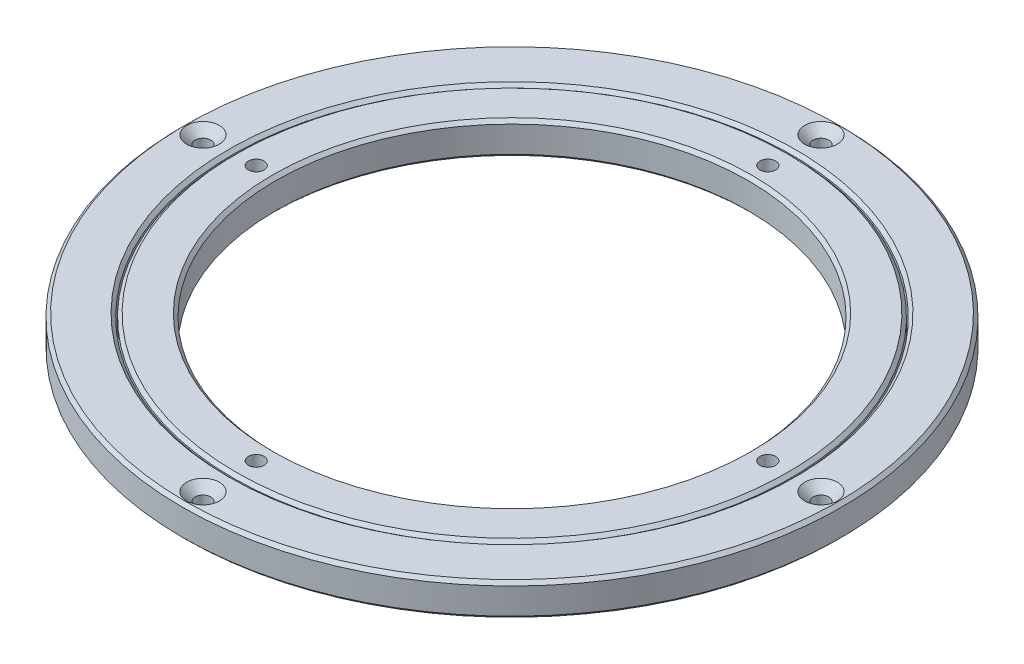
ISO-10303-21;
HEADER;
FILE_DESCRIPTION(('STEP AP214'),'2;1');
FILE_NAME('part.step','',(''),(''),'','','');
FILE_SCHEMA(('AUTOMOTIVE_DESIGN { 1 0 10303 214 1 1 1 1 }'));
ENDSEC;
DATA;
#1=APPLICATION_CONTEXT('core data for automotive mechanical design processes');
#2=APPLICATION_PROTOCOL_DEFINITION('international standard','automotive_design',2000,#1);
#3=PRODUCT_CONTEXT('',#1,'mechanical');
#4=PRODUCT('Part','Part','',(#3));
#5=PRODUCT_RELATED_PRODUCT_CATEGORY('part','',(#4));
#6=PRODUCT_DEFINITION_FORMATION('','',#4);
#7=PRODUCT_DEFINITION_CONTEXT('part definition',#1,'design');
#8=PRODUCT_DEFINITION('design','',#6,#7);
#9=PRODUCT_DEFINITION_SHAPE('','',#8);
#10=(LENGTH_UNIT() NAMED_UNIT(*) SI_UNIT(.MILLI.,.METRE.));
#11=(NAMED_UNIT(*) PLANE_ANGLE_UNIT() SI_UNIT($,.RADIAN.));
#12=(NAMED_UNIT(*) SI_UNIT($,.STERADIAN.) SOLID_ANGLE_UNIT());
#13=UNCERTAINTY_MEASURE_WITH_UNIT(LENGTH_MEASURE(1.E-05),#10,'distance_accuracy_value','');
#14=(GEOMETRIC_REPRESENTATION_CONTEXT(3) GLOBAL_UNCERTAINTY_ASSIGNED_CONTEXT((#13)) GLOBAL_UNIT_ASSIGNED_CONTEXT((#10,
#11,#12)) REPRESENTATION_CONTEXT('',''));
#15=CARTESIAN_POINT('',(0.,0.,0.));
#16=DIRECTION('',(0.,0.,1.));
#17=DIRECTION('',(1.,0.,0.));
#18=AXIS2_PLACEMENT_3D('',#15,#16,#17);
#19=CARTESIAN_POINT('',(0.,0.,0.));
#20=DIRECTION('',(0.,1.,0.));
#21=DIRECTION('',(0.,0.,1.));
#22=AXIS2_PLACEMENT_3D('',#19,#20,#21);
#23=PLANE('',#22);
#24=CARTESIAN_POINT('',(0.,0.,0.));
#25=DIRECTION('',(0.,1.,0.));
#26=DIRECTION('',(0.,0.,1.));
#27=AXIS2_PLACEMENT_3D('',#24,#25,#26);
#28=CIRCLE('',#27,85.475);
#29=CARTESIAN_POINT('',(0.,0.,85.475));
#30=VERTEX_POINT('',#29);
#31=EDGE_CURVE('E113',#30,#30,#28,.T.);
#32=ORIENTED_EDGE('',*,*,#31,.F.);
#33=EDGE_LOOP('',(#32));
#34=FACE_BOUND('',#33,.T.);
#35=CARTESIAN_POINT('',(0.,0.,0.));
#36=DIRECTION('',(0.,1.,0.));
#37=DIRECTION('',(0.,0.,1.));
#38=AXIS2_PLACEMENT_3D('',#35,#36,#37);
#39=CIRCLE('',#38,73.375);
#40=CARTESIAN_POINT('',(0.,0.,73.375));
#41=VERTEX_POINT('',#40);
#42=CARTESIAN_POINT('',(73.375,0.,0.));
#43=VERTEX_POINT('',#42);
#44=EDGE_CURVE('E97',#41,#43,#39,.T.);
#45=ORIENTED_EDGE('',*,*,#44,.T.);
#46=CARTESIAN_POINT('',(78.375,0.,0.));
#47=DIRECTION('',(0.,-1.,0.));
#48=DIRECTION('',(0.,0.,-1.));
#49=AXIS2_PLACEMENT_3D('',#46,#47,#48);
#50=CIRCLE('',#49,5.);
#51=EDGE_CURVE('E69',#43,#43,#50,.T.);
#52=ORIENTED_EDGE('',*,*,#51,.F.);
#53=CARTESIAN_POINT('',(0.,0.,-73.375));
#54=VERTEX_POINT('',#53);
#55=EDGE_CURVE('E75',#43,#54,#39,.T.);
#56=ORIENTED_EDGE('',*,*,#55,.T.);
#57=CARTESIAN_POINT('',(0.,0.,-78.375));
#58=DIRECTION('',(0.,-1.,0.));
#59=DIRECTION('',(0.,0.,-1.));
#60=AXIS2_PLACEMENT_3D('',#57,#58,#59);
#61=CIRCLE('',#60,5.);
#62=EDGE_CURVE('E231',#54,#54,#61,.T.);
#63=ORIENTED_EDGE('',*,*,#62,.F.);
#64=CARTESIAN_POINT('',(-73.375,0.,0.));
#65=VERTEX_POINT('',#64);
#66=EDGE_CURVE('E94',#54,#65,#39,.T.);
#67=ORIENTED_EDGE('',*,*,#66,.T.);
#68=CARTESIAN_POINT('',(-78.375,0.,0.));
#69=DIRECTION('',(0.,-1.,0.));
#70=DIRECTION('',(0.,0.,-1.));
#71=AXIS2_PLACEMENT_3D('',#68,#69,#70);
#72=CIRCLE('',#71,5.);
#73=EDGE_CURVE('E91',#65,#65,#72,.T.);
#74=ORIENTED_EDGE('',*,*,#73,.F.);
#75=EDGE_CURVE('E85',#65,#41,#39,.T.);
#76=ORIENTED_EDGE('',*,*,#75,.T.);
#77=CARTESIAN_POINT('',(0.,0.,78.375));
#78=DIRECTION('',(0.,-1.,0.));
#79=DIRECTION('',(0.,0.,-1.));
#80=AXIS2_PLACEMENT_3D('',#77,#78,#79);
#81=CIRCLE('',#80,5.);
#82=EDGE_CURVE('E88',#41,#41,#81,.T.);
#83=ORIENTED_EDGE('',*,*,#82,.F.);
#84=EDGE_LOOP('',(#45,#52,#56,#63,#67,#74,#76,#83));
#85=FACE_BOUND('',#84,.T.);
#86=ADVANCED_FACE('F55',(#34,#85),#23,.F.);
#87=CARTESIAN_POINT('',(0.,10.,0.));
#88=DIRECTION('',(0.,-1.,0.));
#89=DIRECTION('',(0.,0.,-1.));
#90=AXIS2_PLACEMENT_3D('',#87,#88,#89);
#91=CYLINDRICAL_SURFACE('',#90,72.375);
#92=CARTESIAN_POINT('',(0.,1.00000000000001,0.));
#93=DIRECTION('',(0.,1.,0.));
#94=DIRECTION('',(0.,0.,1.));
#95=AXIS2_PLACEMENT_3D('',#92,#93,#94);
#96=CIRCLE('',#95,72.375);
#97=CARTESIAN_POINT('',(0.,1.00000000000001,72.375));
#98=VERTEX_POINT('',#97);
#99=EDGE_CURVE('E13',#98,#98,#96,.F.);
#100=ORIENTED_EDGE('',*,*,#99,.T.);
#101=EDGE_LOOP('',(#100));
#102=FACE_BOUND('',#101,.T.);
#103=CARTESIAN_POINT('',(0.,9.00000000000003,0.));
#104=DIRECTION('',(0.,1.,0.));
#105=DIRECTION('',(0.,0.,1.));
#106=AXIS2_PLACEMENT_3D('',#103,#104,#105);
#107=CIRCLE('',#106,72.375);
#108=CARTESIAN_POINT('',(0.,9.00000000000003,72.375));
#109=VERTEX_POINT('',#108);
#110=EDGE_CURVE('E64',#109,#109,#107,.T.);
#111=ORIENTED_EDGE('',*,*,#110,.T.);
#112=EDGE_LOOP('',(#111));
#113=FACE_BOUND('',#112,.T.);
#114=ADVANCED_FACE('F126',(#102,#113),#91,.F.);
#115=CARTESIAN_POINT('',(0.,10.,0.));
#116=DIRECTION('',(0.,-1.,0.));
#117=DIRECTION('',(0.,0.,-1.));
#118=AXIS2_PLACEMENT_3D('',#115,#116,#117);
#119=CYLINDRICAL_SURFACE('',#118,85.475);
#120=CARTESIAN_POINT('',(0.,9.00000000000006,0.));
#121=DIRECTION('',(0.,1.,0.));
#122=DIRECTION('',(0.,0.,1.));
#123=AXIS2_PLACEMENT_3D('',#120,#121,#122);
#124=CIRCLE('',#123,85.475);
#125=CARTESIAN_POINT('',(0.,9.00000000000006,85.475));
#126=VERTEX_POINT('',#125);
#127=EDGE_CURVE('E95',#126,#126,#124,.F.);
#128=ORIENTED_EDGE('',*,*,#127,.T.);
#129=EDGE_LOOP('',(#128));
#130=FACE_BOUND('',#129,.T.);
#131=ORIENTED_EDGE('',*,*,#31,.T.);
#132=EDGE_LOOP('',(#131));
#133=FACE_BOUND('',#132,.T.);
#134=ADVANCED_FACE('F151',(#130,#133),#119,.T.);
#135=CARTESIAN_POINT('',(0.,10.,0.));
#136=DIRECTION('',(0.,1.,0.));
#137=DIRECTION('',(0.,0.,1.));
#138=AXIS2_PLACEMENT_3D('',#135,#136,#137);
#139=PLANE('',#138);
#140=CARTESIAN_POINT('',(78.375,9.99999999999999,0.));
#141=DIRECTION('',(0.,-1.,0.));
#142=DIRECTION('',(0.,0.,-1.));
#143=AXIS2_PLACEMENT_3D('',#140,#141,#142);
#144=CIRCLE('',#143,2.39999999999999);
#145=CARTESIAN_POINT('',(78.375,9.99999999999999,-2.39999999999999));
#146=VERTEX_POINT('',#145);
#147=EDGE_CURVE('E185',#146,#146,#144,.T.);
#148=ORIENTED_EDGE('',*,*,#147,.T.);
#149=EDGE_LOOP('',(#148));
#150=FACE_BOUND('',#149,.T.);
#151=CARTESIAN_POINT('',(0.,9.99999999999999,-78.375));
#152=DIRECTION('',(0.,-1.,0.));
#153=DIRECTION('',(0.,0.,-1.));
#154=AXIS2_PLACEMENT_3D('',#151,#152,#153);
#155=CIRCLE('',#154,2.39999999999999);
#156=CARTESIAN_POINT('',(0.,9.99999999999999,-80.775));
#157=VERTEX_POINT('',#156);
#158=EDGE_CURVE('E189',#157,#157,#155,.T.);
#159=ORIENTED_EDGE('',*,*,#158,.T.);
#160=EDGE_LOOP('',(#159));
#161=FACE_BOUND('',#160,.T.);
#162=CARTESIAN_POINT('',(-78.375,9.99999999999999,0.));
#163=DIRECTION('',(0.,-1.,0.));
#164=DIRECTION('',(0.,0.,-1.));
#165=AXIS2_PLACEMENT_3D('',#162,#163,#164);
#166=CIRCLE('',#165,2.39999999999999);
#167=CARTESIAN_POINT('',(-78.375,9.99999999999999,-2.39999999999999));
#168=VERTEX_POINT('',#167);
#169=EDGE_CURVE('E101',#168,#168,#166,.T.);
#170=ORIENTED_EDGE('',*,*,#169,.T.);
#171=EDGE_LOOP('',(#170));
#172=FACE_BOUND('',#171,.T.);
#173=CARTESIAN_POINT('',(0.,9.99999999999999,78.375));
#174=DIRECTION('',(0.,-1.,0.));
#175=DIRECTION('',(0.,0.,-1.));
#176=AXIS2_PLACEMENT_3D('',#173,#174,#175);
#177=CIRCLE('',#176,2.39999999999999);
#178=CARTESIAN_POINT('',(0.,9.99999999999999,75.975));
#179=VERTEX_POINT('',#178);
#180=EDGE_CURVE('E104',#179,#179,#177,.T.);
#181=ORIENTED_EDGE('',*,*,#180,.T.);
#182=EDGE_LOOP('',(#181));
#183=FACE_BOUND('',#182,.T.);
#184=CARTESIAN_POINT('',(0.,10.,0.));
#185=DIRECTION('',(0.,1.,0.));
#186=DIRECTION('',(0.,0.,1.));
#187=AXIS2_PLACEMENT_3D('',#184,#185,#186);
#188=CIRCLE('',#187,84.4750000000001);
#189=CARTESIAN_POINT('',(0.,10.,84.4750000000001));
#190=VERTEX_POINT('',#189);
#191=EDGE_CURVE('E119',#190,#190,#188,.T.);
#192=ORIENTED_EDGE('',*,*,#191,.T.);
#193=EDGE_LOOP('',(#192));
#194=FACE_BOUND('',#193,.T.);
#195=CARTESIAN_POINT('',(0.,10.,0.));
#196=DIRECTION('',(0.,1.,0.));
#197=DIRECTION('',(0.,0.,1.));
#198=AXIS2_PLACEMENT_3D('',#195,#196,#197);
#199=CIRCLE('',#198,73.375);
#200=CARTESIAN_POINT('',(0.,10.,73.375));
#201=VERTEX_POINT('',#200);
#202=EDGE_CURVE('E116',#201,#201,#199,.F.);
#203=ORIENTED_EDGE('',*,*,#202,.T.);
#204=EDGE_LOOP('',(#203));
#205=FACE_BOUND('',#204,.T.);
#206=ADVANCED_FACE('F157',(#150,#161,#172,#183,#194,#205),#139,.T.);
#207=CARTESIAN_POINT('',(0.,10.,0.));
#208=DIRECTION('',(0.,-1.,0.));
#209=DIRECTION('',(0.,0.,-1.));
#210=AXIS2_PLACEMENT_3D('',#207,#208,#209);
#211=CONICAL_SURFACE('',#210,84.4750000000001,0.785398163397441);
#212=ORIENTED_EDGE('',*,*,#127,.F.);
#213=EDGE_LOOP('',(#212));
#214=FACE_BOUND('',#213,.T.);
#215=ORIENTED_EDGE('',*,*,#191,.F.);
#216=EDGE_LOOP('',(#215));
#217=FACE_BOUND('',#216,.T.);
#218=ADVANCED_FACE('F140',(#214,#217),#211,.T.);
#219=CARTESIAN_POINT('',(0.,0.,0.));
#220=DIRECTION('',(0.,-1.,0.));
#221=DIRECTION('',(0.,0.,-1.));
#222=AXIS2_PLACEMENT_3D('',#219,#220,#221);
#223=CONICAL_SURFACE('',#222,73.375,0.785398163397441);
#224=ORIENTED_EDGE('',*,*,#99,.F.);
#225=EDGE_LOOP('',(#224));
#226=FACE_BOUND('',#225,.T.);
#227=ORIENTED_EDGE('',*,*,#44,.F.);
#228=ORIENTED_EDGE('',*,*,#75,.F.);
#229=ORIENTED_EDGE('',*,*,#66,.F.);
#230=ORIENTED_EDGE('',*,*,#55,.F.);
#231=EDGE_LOOP('',(#227,#228,#229,#230));
#232=FACE_BOUND('',#231,.T.);
#233=ADVANCED_FACE('F130',(#226,#232),#223,.F.);
#234=CARTESIAN_POINT('',(0.,9.00000000000003,0.));
#235=DIRECTION('',(0.,1.,0.));
#236=DIRECTION('',(0.,0.,1.));
#237=AXIS2_PLACEMENT_3D('',#234,#235,#236);
#238=CONICAL_SURFACE('',#237,72.375,0.785398163397448);
#239=ORIENTED_EDGE('',*,*,#202,.F.);
#240=EDGE_LOOP('',(#239));
#241=FACE_BOUND('',#240,.T.);
#242=ORIENTED_EDGE('',*,*,#110,.F.);
#243=EDGE_LOOP('',(#242));
#244=FACE_BOUND('',#243,.T.);
#245=ADVANCED_FACE('F58',(#241,#244),#238,.F.);
#246=CARTESIAN_POINT('',(0.,0.,78.375));
#247=DIRECTION('',(0.,-1.,0.));
#248=DIRECTION('',(0.,0.,-1.));
#249=AXIS2_PLACEMENT_3D('',#246,#247,#248);
#250=CYLINDRICAL_SURFACE('',#249,2.39999999999999);
#251=ORIENTED_EDGE('',*,*,#180,.F.);
#252=EDGE_LOOP('',(#251));
#253=FACE_BOUND('',#252,.T.);
#254=CARTESIAN_POINT('',(0.,2.6,78.375));
#255=DIRECTION('',(0.,-1.,0.));
#256=DIRECTION('',(0.,0.,-1.));
#257=AXIS2_PLACEMENT_3D('',#254,#255,#256);
#258=CIRCLE('',#257,2.39999999999999);
#259=CARTESIAN_POINT('',(0.,2.6,75.975));
#260=VERTEX_POINT('',#259);
#261=EDGE_CURVE('E100',#260,#260,#258,.T.);
#262=ORIENTED_EDGE('',*,*,#261,.T.);
#263=EDGE_LOOP('',(#262));
#264=FACE_BOUND('',#263,.T.);
#265=ADVANCED_FACE('F129',(#253,#264),#250,.F.);
#266=CARTESIAN_POINT('',(0.,0.,78.375));
#267=DIRECTION('',(0.,-1.,0.));
#268=DIRECTION('',(0.,0.,-1.));
#269=AXIS2_PLACEMENT_3D('',#266,#267,#268);
#270=CONICAL_SURFACE('',#269,5.,0.78539816339745);
#271=ORIENTED_EDGE('',*,*,#261,.F.);
#272=EDGE_LOOP('',(#271));
#273=FACE_BOUND('',#272,.T.);
#274=ORIENTED_EDGE('',*,*,#82,.T.);
#275=EDGE_LOOP('',(#274));
#276=FACE_BOUND('',#275,.T.);
#277=ADVANCED_FACE('F99',(#273,#276),#270,.F.);
#278=CARTESIAN_POINT('',(-78.375,0.,0.));
#279=DIRECTION('',(0.,-1.,0.));
#280=DIRECTION('',(0.,0.,-1.));
#281=AXIS2_PLACEMENT_3D('',#278,#279,#280);
#282=CYLINDRICAL_SURFACE('',#281,2.39999999999999);
#283=ORIENTED_EDGE('',*,*,#169,.F.);
#284=EDGE_LOOP('',(#283));
#285=FACE_BOUND('',#284,.T.);
#286=CARTESIAN_POINT('',(-78.375,2.6,0.));
#287=DIRECTION('',(0.,-1.,0.));
#288=DIRECTION('',(0.,0.,-1.));
#289=AXIS2_PLACEMENT_3D('',#286,#287,#288);
#290=CIRCLE('',#289,2.39999999999999);
#291=CARTESIAN_POINT('',(-78.375,2.6,-2.39999999999999));
#292=VERTEX_POINT('',#291);
#293=EDGE_CURVE('E107',#292,#292,#290,.T.);
#294=ORIENTED_EDGE('',*,*,#293,.T.);
#295=EDGE_LOOP('',(#294));
#296=FACE_BOUND('',#295,.T.);
#297=ADVANCED_FACE('F197',(#285,#296),#282,.F.);
#298=CARTESIAN_POINT('',(-78.375,0.,0.));
#299=DIRECTION('',(0.,-1.,0.));
#300=DIRECTION('',(0.,0.,-1.));
#301=AXIS2_PLACEMENT_3D('',#298,#299,#300);
#302=CONICAL_SURFACE('',#301,5.,0.785398163397451);
#303=ORIENTED_EDGE('',*,*,#293,.F.);
#304=EDGE_LOOP('',(#303));
#305=FACE_BOUND('',#304,.T.);
#306=ORIENTED_EDGE('',*,*,#73,.T.);
#307=EDGE_LOOP('',(#306));
#308=FACE_BOUND('',#307,.T.);
#309=ADVANCED_FACE('F202',(#305,#308),#302,.F.);
#310=CARTESIAN_POINT('',(0.,0.,-78.375));
#311=DIRECTION('',(0.,-1.,0.));
#312=DIRECTION('',(0.,0.,-1.));
#313=AXIS2_PLACEMENT_3D('',#310,#311,#312);
#314=CYLINDRICAL_SURFACE('',#313,2.39999999999999);
#315=ORIENTED_EDGE('',*,*,#158,.F.);
#316=EDGE_LOOP('',(#315));
#317=FACE_BOUND('',#316,.T.);
#318=CARTESIAN_POINT('',(0.,2.6,-78.375));
#319=DIRECTION('',(0.,-1.,0.));
#320=DIRECTION('',(0.,0.,-1.));
#321=AXIS2_PLACEMENT_3D('',#318,#319,#320);
#322=CIRCLE('',#321,2.39999999999999);
#323=CARTESIAN_POINT('',(0.,2.6,-80.775));
#324=VERTEX_POINT('',#323);
#325=EDGE_CURVE('E236',#324,#324,#322,.T.);
#326=ORIENTED_EDGE('',*,*,#325,.T.);
#327=EDGE_LOOP('',(#326));
#328=FACE_BOUND('',#327,.T.);
#329=ADVANCED_FACE('F208',(#317,#328),#314,.F.);
#330=CARTESIAN_POINT('',(0.,0.,-78.375));
#331=DIRECTION('',(0.,-1.,0.));
#332=DIRECTION('',(0.,0.,-1.));
#333=AXIS2_PLACEMENT_3D('',#330,#331,#332);
#334=CONICAL_SURFACE('',#333,5.,0.78539816339745);
#335=ORIENTED_EDGE('',*,*,#325,.F.);
#336=EDGE_LOOP('',(#335));
#337=FACE_BOUND('',#336,.T.);
#338=ORIENTED_EDGE('',*,*,#62,.T.);
#339=EDGE_LOOP('',(#338));
#340=FACE_BOUND('',#339,.T.);
#341=ADVANCED_FACE('F212',(#337,#340),#334,.F.);
#342=CARTESIAN_POINT('',(78.375,0.,0.));
#343=DIRECTION('',(0.,-1.,0.));
#344=DIRECTION('',(0.,0.,-1.));
#345=AXIS2_PLACEMENT_3D('',#342,#343,#344);
#346=CYLINDRICAL_SURFACE('',#345,2.39999999999999);
#347=ORIENTED_EDGE('',*,*,#147,.F.);
#348=EDGE_LOOP('',(#347));
#349=FACE_BOUND('',#348,.T.);
#350=CARTESIAN_POINT('',(78.375,2.6,0.));
#351=DIRECTION('',(0.,-1.,0.));
#352=DIRECTION('',(0.,0.,-1.));
#353=AXIS2_PLACEMENT_3D('',#350,#351,#352);
#354=CIRCLE('',#353,2.39999999999999);
#355=CARTESIAN_POINT('',(78.375,2.6,-2.39999999999999));
#356=VERTEX_POINT('',#355);
#357=EDGE_CURVE('E228',#356,#356,#354,.T.);
#358=ORIENTED_EDGE('',*,*,#357,.T.);
#359=EDGE_LOOP('',(#358));
#360=FACE_BOUND('',#359,.T.);
#361=ADVANCED_FACE('F216',(#349,#360),#346,.F.);
#362=CARTESIAN_POINT('',(78.375,0.,0.));
#363=DIRECTION('',(0.,-1.,0.));
#364=DIRECTION('',(0.,0.,-1.));
#365=AXIS2_PLACEMENT_3D('',#362,#363,#364);
#366=CONICAL_SURFACE('',#365,5.,0.785398163397451);
#367=ORIENTED_EDGE('',*,*,#357,.F.);
#368=EDGE_LOOP('',(#367));
#369=FACE_BOUND('',#368,.T.);
#370=ORIENTED_EDGE('',*,*,#51,.T.);
#371=EDGE_LOOP('',(#370));
#372=FACE_BOUND('',#371,.T.);
#373=ADVANCED_FACE('F220',(#369,#372),#366,.F.);
#374=CLOSED_SHELL('',(#86,#114,#134,#206,#218,#233,#245,#265,#277,#297,#309,#329,#341,#361,#373));
#375=MANIFOLD_SOLID_BREP('B2',#374);
#376=CARTESIAN_POINT('',(0.,10.,0.));
#377=DIRECTION('',(0.,-1.,0.));
#378=DIRECTION('',(0.,0.,-1.));
#379=AXIS2_PLACEMENT_3D('',#376,#377,#378);
#380=CYLINDRICAL_SURFACE('',#379,85.875);
#381=CARTESIAN_POINT('',(0.,1.00000000000001,0.));
#382=DIRECTION('',(0.,1.,0.));
#383=DIRECTION('',(0.,0.,1.));
#384=AXIS2_PLACEMENT_3D('',#381,#382,#383);
#385=CIRCLE('',#384,85.875);
#386=CARTESIAN_POINT('',(0.,1.00000000000001,85.875));
#387=VERTEX_POINT('',#386);
#388=EDGE_CURVE('E54',#387,#387,#385,.F.);
#389=ORIENTED_EDGE('',*,*,#388,.T.);
#390=EDGE_LOOP('',(#389));
#391=FACE_BOUND('',#390,.T.);
#392=CARTESIAN_POINT('',(0.,8.99999999999997,0.));
#393=DIRECTION('',(0.,1.,0.));
#394=DIRECTION('',(0.,0.,1.));
#395=AXIS2_PLACEMENT_3D('',#392,#393,#394);
#396=CIRCLE('',#395,85.875);
#397=CARTESIAN_POINT('',(0.,8.99999999999997,85.875));
#398=VERTEX_POINT('',#397);
#399=EDGE_CURVE('E393',#398,#398,#396,.T.);
#400=ORIENTED_EDGE('',*,*,#399,.T.);
#401=EDGE_LOOP('',(#400));
#402=FACE_BOUND('',#401,.T.);
#403=ADVANCED_FACE('F385',(#391,#402),#380,.F.);
#404=CARTESIAN_POINT('',(0.,10.,0.));
#405=DIRECTION('',(0.,-1.,0.));
#406=DIRECTION('',(0.,0.,-1.));
#407=AXIS2_PLACEMENT_3D('',#404,#405,#406);
#408=CYLINDRICAL_SURFACE('',#407,100.975);
#409=CARTESIAN_POINT('',(0.,1.00000000000003,0.));
#410=DIRECTION('',(0.,1.,0.));
#411=DIRECTION('',(0.,0.,1.));
#412=AXIS2_PLACEMENT_3D('',#409,#410,#411);
#413=CIRCLE('',#412,100.975);
#414=CARTESIAN_POINT('',(0.,1.00000000000003,100.975));
#415=VERTEX_POINT('',#414);
#416=EDGE_CURVE('E412',#415,#415,#413,.T.);
#417=ORIENTED_EDGE('',*,*,#416,.T.);
#418=EDGE_LOOP('',(#417));
#419=FACE_BOUND('',#418,.T.);
#420=CARTESIAN_POINT('',(0.,9.00000000000003,0.));
#421=DIRECTION('',(0.,1.,0.));
#422=DIRECTION('',(0.,0.,1.));
#423=AXIS2_PLACEMENT_3D('',#420,#421,#422);
#424=CIRCLE('',#423,100.975);
#425=CARTESIAN_POINT('',(0.,9.00000000000003,100.975));
#426=VERTEX_POINT('',#425);
#427=EDGE_CURVE('E415',#426,#426,#424,.F.);
#428=ORIENTED_EDGE('',*,*,#427,.T.);
#429=EDGE_LOOP('',(#428));
#430=FACE_BOUND('',#429,.T.);
#431=ADVANCED_FACE('F461',(#419,#430),#408,.T.);
#432=CARTESIAN_POINT('',(0.,10.,0.));
#433=DIRECTION('',(0.,1.,0.));
#434=DIRECTION('',(0.,0.,1.));
#435=AXIS2_PLACEMENT_3D('',#432,#433,#434);
#436=PLANE('',#435);
#437=CARTESIAN_POINT('',(94.675,10.,0.));
#438=DIRECTION('',(0.,1.,0.));
#439=DIRECTION('',(0.,0.,1.));
#440=AXIS2_PLACEMENT_3D('',#437,#438,#439);
#441=CIRCLE('',#440,5.);
#442=CARTESIAN_POINT('',(94.675,10.,5.));
#443=VERTEX_POINT('',#442);
#444=EDGE_CURVE('E451',#443,#443,#441,.T.);
#445=ORIENTED_EDGE('',*,*,#444,.F.);
#446=EDGE_LOOP('',(#445));
#447=FACE_BOUND('',#446,.T.);
#448=CARTESIAN_POINT('',(0.,10.,94.675));
#449=DIRECTION('',(0.,1.,0.));
#450=DIRECTION('',(0.,0.,1.));
#451=AXIS2_PLACEMENT_3D('',#448,#449,#450);
#452=CIRCLE('',#451,5.);
#453=CARTESIAN_POINT('',(0.,10.,99.675));
#454=VERTEX_POINT('',#453);
#455=EDGE_CURVE('E442',#454,#454,#452,.T.);
#456=ORIENTED_EDGE('',*,*,#455,.F.);
#457=EDGE_LOOP('',(#456));
#458=FACE_BOUND('',#457,.T.);
#459=CARTESIAN_POINT('',(-94.675,10.,0.));
#460=DIRECTION('',(0.,1.,0.));
#461=DIRECTION('',(0.,0.,1.));
#462=AXIS2_PLACEMENT_3D('',#459,#460,#461);
#463=CIRCLE('',#462,5.);
#464=CARTESIAN_POINT('',(-94.675,10.,5.));
#465=VERTEX_POINT('',#464);
#466=EDGE_CURVE('E433',#465,#465,#463,.T.);
#467=ORIENTED_EDGE('',*,*,#466,.F.);
#468=EDGE_LOOP('',(#467));
#469=FACE_BOUND('',#468,.T.);
#470=CARTESIAN_POINT('',(0.,10.,-94.675));
#471=DIRECTION('',(0.,1.,0.));
#472=DIRECTION('',(0.,0.,1.));
#473=AXIS2_PLACEMENT_3D('',#470,#471,#472);
#474=CIRCLE('',#473,5.);
#475=CARTESIAN_POINT('',(0.,10.,-89.675));
#476=VERTEX_POINT('',#475);
#477=EDGE_CURVE('E424',#476,#476,#474,.T.);
#478=ORIENTED_EDGE('',*,*,#477,.F.);
#479=EDGE_LOOP('',(#478));
#480=FACE_BOUND('',#479,.T.);
#481=CARTESIAN_POINT('',(0.,10.,0.));
#482=DIRECTION('',(0.,1.,0.));
#483=DIRECTION('',(0.,0.,1.));
#484=AXIS2_PLACEMENT_3D('',#481,#482,#483);
#485=CIRCLE('',#484,99.975);
#486=CARTESIAN_POINT('',(0.,10.,99.975));
#487=VERTEX_POINT('',#486);
#488=EDGE_CURVE('E397',#487,#487,#485,.T.);
#489=ORIENTED_EDGE('',*,*,#488,.T.);
#490=EDGE_LOOP('',(#489));
#491=FACE_BOUND('',#490,.T.);
#492=CARTESIAN_POINT('',(0.,10.,0.));
#493=DIRECTION('',(0.,1.,0.));
#494=DIRECTION('',(0.,0.,1.));
#495=AXIS2_PLACEMENT_3D('',#492,#493,#494);
#496=CIRCLE('',#495,86.875);
#497=CARTESIAN_POINT('',(0.,10.,86.875));
#498=VERTEX_POINT('',#497);
#499=EDGE_CURVE('E401',#498,#498,#496,.F.);
#500=ORIENTED_EDGE('',*,*,#499,.T.);
#501=EDGE_LOOP('',(#500));
#502=FACE_BOUND('',#501,.T.);
#503=ADVANCED_FACE('F457',(#447,#458,#469,#480,#491,#502),#436,.T.);
#504=CARTESIAN_POINT('',(0.,0.,0.));
#505=DIRECTION('',(0.,1.,0.));
#506=DIRECTION('',(0.,0.,1.));
#507=AXIS2_PLACEMENT_3D('',#504,#505,#506);
#508=PLANE('',#507);
#509=CARTESIAN_POINT('',(94.675,0.,0.));
#510=DIRECTION('',(0.,1.,0.));
#511=DIRECTION('',(0.,0.,1.));
#512=AXIS2_PLACEMENT_3D('',#509,#510,#511);
#513=CIRCLE('',#512,2.4);
#514=CARTESIAN_POINT('',(94.675,0.,2.4));
#515=VERTEX_POINT('',#514);
#516=EDGE_CURVE('E445',#515,#515,#513,.T.);
#517=ORIENTED_EDGE('',*,*,#516,.T.);
#518=EDGE_LOOP('',(#517));
#519=FACE_BOUND('',#518,.T.);
#520=CARTESIAN_POINT('',(0.,0.,94.675));
#521=DIRECTION('',(0.,1.,0.));
#522=DIRECTION('',(0.,0.,1.));
#523=AXIS2_PLACEMENT_3D('',#520,#521,#522);
#524=CIRCLE('',#523,2.4);
#525=CARTESIAN_POINT('',(0.,0.,97.075));
#526=VERTEX_POINT('',#525);
#527=EDGE_CURVE('E436',#526,#526,#524,.T.);
#528=ORIENTED_EDGE('',*,*,#527,.T.);
#529=EDGE_LOOP('',(#528));
#530=FACE_BOUND('',#529,.T.);
#531=CARTESIAN_POINT('',(-94.675,0.,0.));
#532=DIRECTION('',(0.,1.,0.));
#533=DIRECTION('',(0.,0.,1.));
#534=AXIS2_PLACEMENT_3D('',#531,#532,#533);
#535=CIRCLE('',#534,2.4);
#536=CARTESIAN_POINT('',(-94.675,0.,2.4));
#537=VERTEX_POINT('',#536);
#538=EDGE_CURVE('E427',#537,#537,#535,.T.);
#539=ORIENTED_EDGE('',*,*,#538,.T.);
#540=EDGE_LOOP('',(#539));
#541=FACE_BOUND('',#540,.T.);
#542=CARTESIAN_POINT('',(0.,0.,-94.675));
#543=DIRECTION('',(0.,1.,0.));
#544=DIRECTION('',(0.,0.,1.));
#545=AXIS2_PLACEMENT_3D('',#542,#543,#544);
#546=CIRCLE('',#545,2.4);
#547=CARTESIAN_POINT('',(0.,0.,-92.275));
#548=VERTEX_POINT('',#547);
#549=EDGE_CURVE('E418',#548,#548,#546,.T.);
#550=ORIENTED_EDGE('',*,*,#549,.T.);
#551=EDGE_LOOP('',(#550));
#552=FACE_BOUND('',#551,.T.);
#553=CARTESIAN_POINT('',(0.,0.,0.));
#554=DIRECTION('',(0.,1.,0.));
#555=DIRECTION('',(0.,0.,1.));
#556=AXIS2_PLACEMENT_3D('',#553,#554,#555);
#557=CIRCLE('',#556,99.9749999999999);
#558=CARTESIAN_POINT('',(0.,0.,99.9749999999999));
#559=VERTEX_POINT('',#558);
#560=EDGE_CURVE('E406',#559,#559,#557,.F.);
#561=ORIENTED_EDGE('',*,*,#560,.T.);
#562=EDGE_LOOP('',(#561));
#563=FACE_BOUND('',#562,.T.);
#564=CARTESIAN_POINT('',(0.,0.,0.));
#565=DIRECTION('',(0.,1.,0.));
#566=DIRECTION('',(0.,0.,1.));
#567=AXIS2_PLACEMENT_3D('',#564,#565,#566);
#568=CIRCLE('',#567,86.875);
#569=CARTESIAN_POINT('',(0.,0.,86.875));
#570=VERTEX_POINT('',#569);
#571=EDGE_CURVE('E409',#570,#570,#568,.T.);
#572=ORIENTED_EDGE('',*,*,#571,.T.);
#573=EDGE_LOOP('',(#572));
#574=FACE_BOUND('',#573,.T.);
#575=ADVANCED_FACE('F460',(#519,#530,#541,#552,#563,#574),#508,.F.);
#576=CARTESIAN_POINT('',(0.,1.00000000000003,0.));
#577=DIRECTION('',(0.,1.,0.));
#578=DIRECTION('',(0.,0.,1.));
#579=AXIS2_PLACEMENT_3D('',#576,#577,#578);
#580=CONICAL_SURFACE('',#579,100.975,0.785398163397462);
#581=ORIENTED_EDGE('',*,*,#560,.F.);
#582=EDGE_LOOP('',(#581));
#583=FACE_BOUND('',#582,.T.);
#584=ORIENTED_EDGE('',*,*,#416,.F.);
#585=EDGE_LOOP('',(#584));
#586=FACE_BOUND('',#585,.T.);
#587=ADVANCED_FACE('F496',(#583,#586),#580,.T.);
#588=CARTESIAN_POINT('',(0.,10.,0.));
#589=DIRECTION('',(0.,-1.,0.));
#590=DIRECTION('',(0.,0.,-1.));
#591=AXIS2_PLACEMENT_3D('',#588,#589,#590);
#592=CONICAL_SURFACE('',#591,99.975,0.785398163397448);
#593=ORIENTED_EDGE('',*,*,#427,.F.);
#594=EDGE_LOOP('',(#593));
#595=FACE_BOUND('',#594,.T.);
#596=ORIENTED_EDGE('',*,*,#488,.F.);
#597=EDGE_LOOP('',(#596));
#598=FACE_BOUND('',#597,.T.);
#599=ADVANCED_FACE('F484',(#595,#598),#592,.T.);
#600=CARTESIAN_POINT('',(0.,0.,0.));
#601=DIRECTION('',(0.,-1.,0.));
#602=DIRECTION('',(0.,0.,-1.));
#603=AXIS2_PLACEMENT_3D('',#600,#601,#602);
#604=CONICAL_SURFACE('',#603,86.875,0.785398163397448);
#605=ORIENTED_EDGE('',*,*,#388,.F.);
#606=EDGE_LOOP('',(#605));
#607=FACE_BOUND('',#606,.T.);
#608=ORIENTED_EDGE('',*,*,#571,.F.);
#609=EDGE_LOOP('',(#608));
#610=FACE_BOUND('',#609,.T.);
#611=ADVANCED_FACE('F476',(#607,#610),#604,.F.);
#612=CARTESIAN_POINT('',(0.,8.99999999999997,0.));
#613=DIRECTION('',(0.,1.,0.));
#614=DIRECTION('',(0.,0.,1.));
#615=AXIS2_PLACEMENT_3D('',#612,#613,#614);
#616=CONICAL_SURFACE('',#615,85.875,0.785398163397455);
#617=ORIENTED_EDGE('',*,*,#499,.F.);
#618=EDGE_LOOP('',(#617));
#619=FACE_BOUND('',#618,.T.);
#620=ORIENTED_EDGE('',*,*,#399,.F.);
#621=EDGE_LOOP('',(#620));
#622=FACE_BOUND('',#621,.T.);
#623=ADVANCED_FACE('F388',(#619,#622),#616,.F.);
#624=CARTESIAN_POINT('',(0.,10.,-94.675));
#625=DIRECTION('',(0.,1.,0.));
#626=DIRECTION('',(0.,0.,1.));
#627=AXIS2_PLACEMENT_3D('',#624,#625,#626);
#628=CYLINDRICAL_SURFACE('',#627,2.4);
#629=ORIENTED_EDGE('',*,*,#549,.F.);
#630=EDGE_LOOP('',(#629));
#631=FACE_BOUND('',#630,.T.);
#632=CARTESIAN_POINT('',(0.,7.4,-94.675));
#633=DIRECTION('',(0.,1.,0.));
#634=DIRECTION('',(0.,0.,1.));
#635=AXIS2_PLACEMENT_3D('',#632,#633,#634);
#636=CIRCLE('',#635,2.4);
#637=CARTESIAN_POINT('',(0.,7.4,-92.275));
#638=VERTEX_POINT('',#637);
#639=EDGE_CURVE('E421',#638,#638,#636,.T.);
#640=ORIENTED_EDGE('',*,*,#639,.T.);
#641=EDGE_LOOP('',(#640));
#642=FACE_BOUND('',#641,.T.);
#643=ADVANCED_FACE('F475',(#631,#642),#628,.F.);
#644=CARTESIAN_POINT('',(0.,10.,-94.675));
#645=DIRECTION('',(0.,1.,0.));
#646=DIRECTION('',(0.,0.,1.));
#647=AXIS2_PLACEMENT_3D('',#644,#645,#646);
#648=CONICAL_SURFACE('',#647,5.,0.785398163397448);
#649=ORIENTED_EDGE('',*,*,#639,.F.);
#650=EDGE_LOOP('',(#649));
#651=FACE_BOUND('',#650,.T.);
#652=ORIENTED_EDGE('',*,*,#477,.T.);
#653=EDGE_LOOP('',(#652));
#654=FACE_BOUND('',#653,.T.);
#655=ADVANCED_FACE('F481',(#651,#654),#648,.F.);
#656=CARTESIAN_POINT('',(-94.675,10.,0.));
#657=DIRECTION('',(0.,1.,0.));
#658=DIRECTION('',(0.,0.,1.));
#659=AXIS2_PLACEMENT_3D('',#656,#657,#658);
#660=CYLINDRICAL_SURFACE('',#659,2.4);
#661=ORIENTED_EDGE('',*,*,#538,.F.);
#662=EDGE_LOOP('',(#661));
#663=FACE_BOUND('',#662,.T.);
#664=CARTESIAN_POINT('',(-94.675,7.4,0.));
#665=DIRECTION('',(0.,1.,0.));
#666=DIRECTION('',(0.,0.,1.));
#667=AXIS2_PLACEMENT_3D('',#664,#665,#666);
#668=CIRCLE('',#667,2.4);
#669=CARTESIAN_POINT('',(-94.675,7.4,2.4));
#670=VERTEX_POINT('',#669);
#671=EDGE_CURVE('E430',#670,#670,#668,.T.);
#672=ORIENTED_EDGE('',*,*,#671,.T.);
#673=EDGE_LOOP('',(#672));
#674=FACE_BOUND('',#673,.T.);
#675=ADVANCED_FACE('F544',(#663,#674),#660,.F.);
#676=CARTESIAN_POINT('',(-94.675,10.,0.));
#677=DIRECTION('',(0.,1.,0.));
#678=DIRECTION('',(0.,0.,1.));
#679=AXIS2_PLACEMENT_3D('',#676,#677,#678);
#680=CONICAL_SURFACE('',#679,5.,0.785398163397449);
#681=ORIENTED_EDGE('',*,*,#671,.F.);
#682=EDGE_LOOP('',(#681));
#683=FACE_BOUND('',#682,.T.);
#684=ORIENTED_EDGE('',*,*,#466,.T.);
#685=EDGE_LOOP('',(#684));
#686=FACE_BOUND('',#685,.T.);
#687=ADVANCED_FACE('F554',(#683,#686),#680,.F.);
#688=CARTESIAN_POINT('',(0.,10.,94.675));
#689=DIRECTION('',(0.,1.,0.));
#690=DIRECTION('',(0.,0.,1.));
#691=AXIS2_PLACEMENT_3D('',#688,#689,#690);
#692=CYLINDRICAL_SURFACE('',#691,2.4);
#693=ORIENTED_EDGE('',*,*,#527,.F.);
#694=EDGE_LOOP('',(#693));
#695=FACE_BOUND('',#694,.T.);
#696=CARTESIAN_POINT('',(0.,7.4,94.675));
#697=DIRECTION('',(0.,1.,0.));
#698=DIRECTION('',(0.,0.,1.));
#699=AXIS2_PLACEMENT_3D('',#696,#697,#698);
#700=CIRCLE('',#699,2.4);
#701=CARTESIAN_POINT('',(0.,7.4,97.075));
#702=VERTEX_POINT('',#701);
#703=EDGE_CURVE('E439',#702,#702,#700,.T.);
#704=ORIENTED_EDGE('',*,*,#703,.T.);
#705=EDGE_LOOP('',(#704));
#706=FACE_BOUND('',#705,.T.);
#707=ADVANCED_FACE('F564',(#695,#706),#692,.F.);
#708=CARTESIAN_POINT('',(0.,10.,94.675));
#709=DIRECTION('',(0.,1.,0.));
#710=DIRECTION('',(0.,0.,1.));
#711=AXIS2_PLACEMENT_3D('',#708,#709,#710);
#712=CONICAL_SURFACE('',#711,5.,0.785398163397448);
#713=ORIENTED_EDGE('',*,*,#703,.F.);
#714=EDGE_LOOP('',(#713));
#715=FACE_BOUND('',#714,.T.);
#716=ORIENTED_EDGE('',*,*,#455,.T.);
#717=EDGE_LOOP('',(#716));
#718=FACE_BOUND('',#717,.T.);
#719=ADVANCED_FACE('F574',(#715,#718),#712,.F.);
#720=CARTESIAN_POINT('',(94.675,10.,0.));
#721=DIRECTION('',(0.,1.,0.));
#722=DIRECTION('',(0.,0.,1.));
#723=AXIS2_PLACEMENT_3D('',#720,#721,#722);
#724=CYLINDRICAL_SURFACE('',#723,2.4);
#725=ORIENTED_EDGE('',*,*,#516,.F.);
#726=EDGE_LOOP('',(#725));
#727=FACE_BOUND('',#726,.T.);
#728=CARTESIAN_POINT('',(94.675,7.4,0.));
#729=DIRECTION('',(0.,1.,0.));
#730=DIRECTION('',(0.,0.,1.));
#731=AXIS2_PLACEMENT_3D('',#728,#729,#730);
#732=CIRCLE('',#731,2.4);
#733=CARTESIAN_POINT('',(94.675,7.4,2.4));
#734=VERTEX_POINT('',#733);
#735=EDGE_CURVE('E448',#734,#734,#732,.T.);
#736=ORIENTED_EDGE('',*,*,#735,.T.);
#737=EDGE_LOOP('',(#736));
#738=FACE_BOUND('',#737,.T.);
#739=ADVANCED_FACE('F584',(#727,#738),#724,.F.);
#740=CARTESIAN_POINT('',(94.675,10.,0.));
#741=DIRECTION('',(0.,1.,0.));
#742=DIRECTION('',(0.,0.,1.));
#743=AXIS2_PLACEMENT_3D('',#740,#741,#742);
#744=CONICAL_SURFACE('',#743,5.,0.785398163397449);
#745=ORIENTED_EDGE('',*,*,#735,.F.);
#746=EDGE_LOOP('',(#745));
#747=FACE_BOUND('',#746,.T.);
#748=ORIENTED_EDGE('',*,*,#444,.T.);
#749=EDGE_LOOP('',(#748));
#750=FACE_BOUND('',#749,.T.);
#751=ADVANCED_FACE('F455',(#747,#750),#744,.F.);
#752=CLOSED_SHELL('',(#403,#431,#503,#575,#587,#599,#611,#623,#643,#655,#675,#687,#707,#719,
#739,#751));
#753=MANIFOLD_SOLID_BREP('B7',#752);
#754=ADVANCED_BREP_SHAPE_REPRESENTATION('',(#18,#375,#753),#14);
#755=SHAPE_DEFINITION_REPRESENTATION(#9,#754);
ENDSEC;
END-ISO-10303-21;
